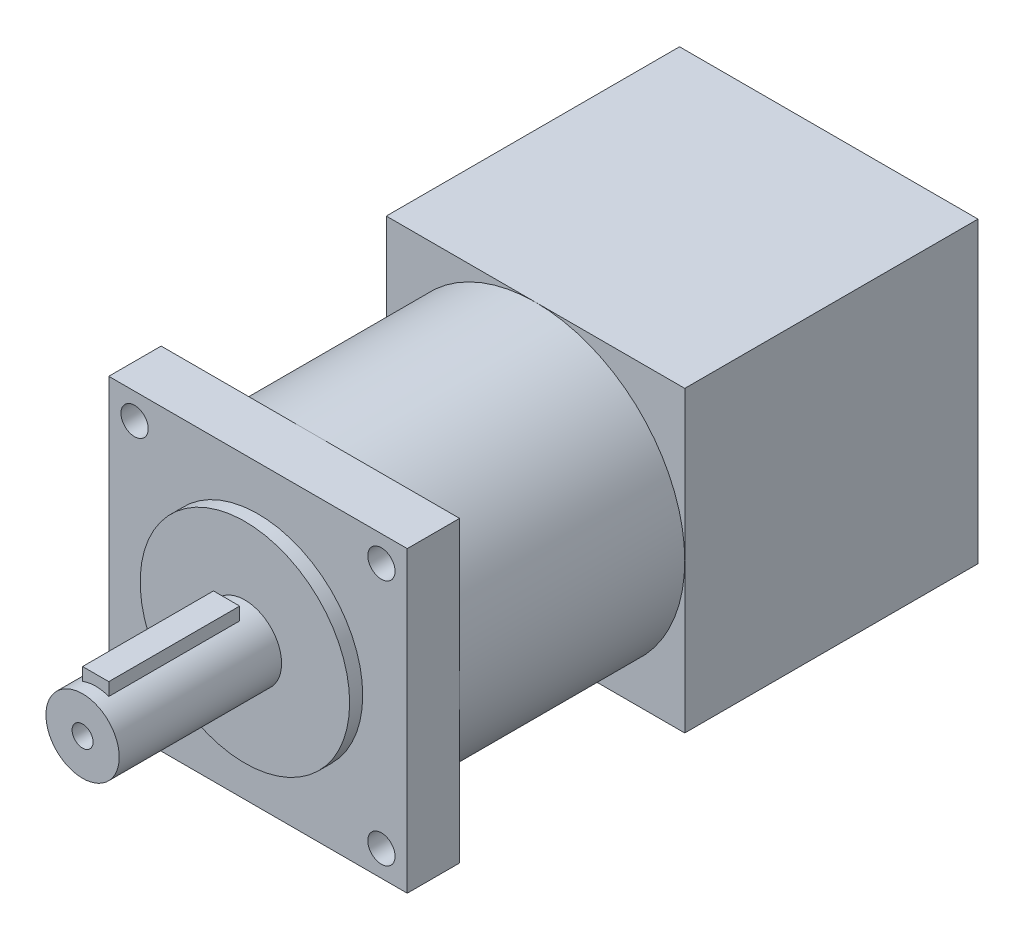
ISO-10303-21;
HEADER;
FILE_DESCRIPTION(('STEP AP214'),'2;1');
FILE_NAME('part.step','',(''),(''),'','','');
FILE_SCHEMA(('AUTOMOTIVE_DESIGN { 1 0 10303 214 1 1 1 1 }'));
ENDSEC;
DATA;
#1=APPLICATION_CONTEXT('core data for automotive mechanical design processes');
#2=APPLICATION_PROTOCOL_DEFINITION('international standard','automotive_design',2000,#1);
#3=PRODUCT_CONTEXT('',#1,'mechanical');
#4=PRODUCT('Part','Part','',(#3));
#5=PRODUCT_RELATED_PRODUCT_CATEGORY('part','',(#4));
#6=PRODUCT_DEFINITION_FORMATION('','',#4);
#7=PRODUCT_DEFINITION_CONTEXT('part definition',#1,'design');
#8=PRODUCT_DEFINITION('design','',#6,#7);
#9=PRODUCT_DEFINITION_SHAPE('','',#8);
#10=(LENGTH_UNIT() NAMED_UNIT(*) SI_UNIT(.MILLI.,.METRE.));
#11=(NAMED_UNIT(*) PLANE_ANGLE_UNIT() SI_UNIT($,.RADIAN.));
#12=(NAMED_UNIT(*) SI_UNIT($,.STERADIAN.) SOLID_ANGLE_UNIT());
#13=UNCERTAINTY_MEASURE_WITH_UNIT(LENGTH_MEASURE(1.E-05),#10,'distance_accuracy_value','');
#14=(GEOMETRIC_REPRESENTATION_CONTEXT(3) GLOBAL_UNCERTAINTY_ASSIGNED_CONTEXT((#13)) GLOBAL_UNIT_ASSIGNED_CONTEXT((#10,
#11,#12)) REPRESENTATION_CONTEXT('',''));
#15=CARTESIAN_POINT('',(0.,0.,0.));
#16=DIRECTION('',(0.,0.,1.));
#17=DIRECTION('',(1.,0.,0.));
#18=AXIS2_PLACEMENT_3D('',#15,#16,#17);
#19=CARTESIAN_POINT('',(0.,0.,142.5));
#20=DIRECTION('',(0.,0.,-1.));
#21=DIRECTION('',(-1.,0.,0.));
#22=AXIS2_PLACEMENT_3D('',#19,#20,#21);
#23=CYLINDRICAL_SURFACE('',#22,7.);
#24=CARTESIAN_POINT('',(0.,0.,111.5));
#25=DIRECTION('',(0.,0.,1.));
#26=DIRECTION('',(1.,0.,0.));
#27=AXIS2_PLACEMENT_3D('',#24,#25,#26);
#28=CIRCLE('',#27,7.);
#29=CARTESIAN_POINT('',(7.,0.,111.5));
#30=VERTEX_POINT('',#29);
#31=EDGE_CURVE('E246',#30,#30,#28,.T.);
#32=ORIENTED_EDGE('',*,*,#31,.T.);
#33=EDGE_LOOP('',(#32));
#34=FACE_BOUND('',#33,.T.);
#35=CARTESIAN_POINT('',(0.,0.,142.5));
#36=DIRECTION('',(0.,0.,1.));
#37=DIRECTION('',(1.,0.,0.));
#38=AXIS2_PLACEMENT_3D('',#35,#36,#37);
#39=CIRCLE('',#38,7.);
#40=CARTESIAN_POINT('',(7.,0.,142.5));
#41=VERTEX_POINT('',#40);
#42=EDGE_CURVE('E234',#41,#41,#39,.T.);
#43=ORIENTED_EDGE('',*,*,#42,.F.);
#44=EDGE_LOOP('',(#43));
#45=FACE_BOUND('',#44,.T.);
#46=CARTESIAN_POINT('',(0.,0.,115.));
#47=DIRECTION('',(0.,0.,1.));
#48=DIRECTION('',(1.,0.,0.));
#49=AXIS2_PLACEMENT_3D('',#46,#47,#48);
#50=CIRCLE('',#49,7.);
#51=CARTESIAN_POINT('',(2.5,6.53834841531101,115.));
#52=VERTEX_POINT('',#51);
#53=CARTESIAN_POINT('',(-2.5,6.53834841531101,115.));
#54=VERTEX_POINT('',#53);
#55=EDGE_CURVE('E11',#52,#54,#50,.T.);
#56=ORIENTED_EDGE('',*,*,#55,.F.);
#57=DIRECTION('',(0.,0.,-1.));
#58=VECTOR('',#57,1.);
#59=CARTESIAN_POINT('',(2.5,6.53834841531101,142.5));
#60=LINE('',#59,#58);
#61=CARTESIAN_POINT('',(2.5,6.53834841531101,140.));
#62=VERTEX_POINT('',#61);
#63=EDGE_CURVE('E156',#52,#62,#60,.F.);
#64=ORIENTED_EDGE('',*,*,#63,.T.);
#65=CARTESIAN_POINT('',(0.,0.,140.));
#66=DIRECTION('',(0.,0.,1.));
#67=DIRECTION('',(1.,0.,0.));
#68=AXIS2_PLACEMENT_3D('',#65,#66,#67);
#69=CIRCLE('',#68,7.);
#70=CARTESIAN_POINT('',(-2.5,6.53834841531101,140.));
#71=VERTEX_POINT('',#70);
#72=EDGE_CURVE('E300',#62,#71,#69,.T.);
#73=ORIENTED_EDGE('',*,*,#72,.T.);
#74=DIRECTION('',(0.,0.,-1.));
#75=VECTOR('',#74,1.);
#76=CARTESIAN_POINT('',(-2.5,6.53834841531101,142.5));
#77=LINE('',#76,#75);
#78=EDGE_CURVE('E43',#71,#54,#77,.T.);
#79=ORIENTED_EDGE('',*,*,#78,.T.);
#80=EDGE_LOOP('',(#56,#64,#73,#79));
#81=FACE_BOUND('',#80,.T.);
#82=ADVANCED_FACE('F35',(#34,#45,#81),#23,.T.);
#83=CARTESIAN_POINT('',(0.,0.,109.));
#84=DIRECTION('',(0.,0.,1.));
#85=DIRECTION('',(1.,0.,0.));
#86=AXIS2_PLACEMENT_3D('',#83,#84,#85);
#87=PLANE('',#86);
#88=CARTESIAN_POINT('',(0.,0.,109.));
#89=DIRECTION('',(0.,0.,1.));
#90=DIRECTION('',(1.,0.,0.));
#91=AXIS2_PLACEMENT_3D('',#88,#89,#90);
#92=CIRCLE('',#91,20.);
#93=CARTESIAN_POINT('',(20.,0.,109.));
#94=VERTEX_POINT('',#93);
#95=EDGE_CURVE('E250',#94,#94,#92,.T.);
#96=ORIENTED_EDGE('',*,*,#95,.F.);
#97=EDGE_LOOP('',(#96));
#98=FACE_BOUND('',#97,.T.);
#99=DIRECTION('',(1.,0.,0.));
#100=VECTOR('',#99,1.);
#101=CARTESIAN_POINT('',(-28.5,-28.5,109.));
#102=LINE('',#101,#100);
#103=CARTESIAN_POINT('',(-28.5,-28.5,109.));
#104=VERTEX_POINT('',#103);
#105=CARTESIAN_POINT('',(28.5,-28.5,109.));
#106=VERTEX_POINT('',#105);
#107=EDGE_CURVE('E228',#104,#106,#102,.T.);
#108=ORIENTED_EDGE('',*,*,#107,.T.);
#109=DIRECTION('',(0.,1.,0.));
#110=VECTOR('',#109,1.);
#111=CARTESIAN_POINT('',(28.5,-28.5,109.));
#112=LINE('',#111,#110);
#113=CARTESIAN_POINT('',(28.5,28.5,109.));
#114=VERTEX_POINT('',#113);
#115=EDGE_CURVE('E203',#106,#114,#112,.T.);
#116=ORIENTED_EDGE('',*,*,#115,.T.);
#117=DIRECTION('',(-1.,0.,0.));
#118=VECTOR('',#117,1.);
#119=CARTESIAN_POINT('',(-28.5,28.5,109.));
#120=LINE('',#119,#118);
#121=CARTESIAN_POINT('',(-28.5,28.5,109.));
#122=VERTEX_POINT('',#121);
#123=EDGE_CURVE('E223',#114,#122,#120,.T.);
#124=ORIENTED_EDGE('',*,*,#123,.T.);
#125=DIRECTION('',(0.,-1.,0.));
#126=VECTOR('',#125,1.);
#127=CARTESIAN_POINT('',(-28.5,-28.5,109.));
#128=LINE('',#127,#126);
#129=EDGE_CURVE('E225',#122,#104,#128,.T.);
#130=ORIENTED_EDGE('',*,*,#129,.T.);
#131=EDGE_LOOP('',(#108,#116,#124,#130));
#132=FACE_BOUND('',#131,.T.);
#133=CARTESIAN_POINT('',(-23.5699999999987,-23.57,109.));
#134=DIRECTION('',(0.,0.,1.));
#135=DIRECTION('',(1.,0.,0.));
#136=AXIS2_PLACEMENT_3D('',#133,#134,#135);
#137=CIRCLE('',#136,2.60000000000069);
#138=CARTESIAN_POINT('',(-20.969999999998,-23.57,109.));
#139=VERTEX_POINT('',#138);
#140=EDGE_CURVE('E180',#139,#139,#137,.T.);
#141=ORIENTED_EDGE('',*,*,#140,.F.);
#142=EDGE_LOOP('',(#141));
#143=FACE_BOUND('',#142,.T.);
#144=CARTESIAN_POINT('',(23.5700000000013,-23.5699999999987,109.));
#145=DIRECTION('',(0.,0.,1.));
#146=DIRECTION('',(1.,0.,0.));
#147=AXIS2_PLACEMENT_3D('',#144,#145,#146);
#148=CIRCLE('',#147,2.60000000000186);
#149=CARTESIAN_POINT('',(26.1700000000032,-23.5699999999987,109.));
#150=VERTEX_POINT('',#149);
#151=EDGE_CURVE('E185',#150,#150,#148,.T.);
#152=ORIENTED_EDGE('',*,*,#151,.F.);
#153=EDGE_LOOP('',(#152));
#154=FACE_BOUND('',#153,.T.);
#155=CARTESIAN_POINT('',(23.57,23.5700000000013,109.));
#156=DIRECTION('',(0.,0.,1.));
#157=DIRECTION('',(1.,0.,0.));
#158=AXIS2_PLACEMENT_3D('',#155,#156,#157);
#159=CIRCLE('',#158,2.60000000000137);
#160=CARTESIAN_POINT('',(26.1700000000014,23.5700000000013,109.));
#161=VERTEX_POINT('',#160);
#162=EDGE_CURVE('E191',#161,#161,#159,.T.);
#163=ORIENTED_EDGE('',*,*,#162,.F.);
#164=EDGE_LOOP('',(#163));
#165=FACE_BOUND('',#164,.T.);
#166=CARTESIAN_POINT('',(-23.57,23.57,109.));
#167=DIRECTION('',(0.,0.,1.));
#168=DIRECTION('',(1.,0.,0.));
#169=AXIS2_PLACEMENT_3D('',#166,#167,#168);
#170=CIRCLE('',#169,2.6);
#171=CARTESIAN_POINT('',(-20.97,23.57,109.));
#172=VERTEX_POINT('',#171);
#173=EDGE_CURVE('E197',#172,#172,#170,.T.);
#174=ORIENTED_EDGE('',*,*,#173,.F.);
#175=EDGE_LOOP('',(#174));
#176=FACE_BOUND('',#175,.T.);
#177=ADVANCED_FACE('F332',(#98,#132,#143,#154,#165,#176),#87,.T.);
#178=CARTESIAN_POINT('',(0.,0.,111.5));
#179=DIRECTION('',(0.,0.,-1.));
#180=DIRECTION('',(-1.,0.,0.));
#181=AXIS2_PLACEMENT_3D('',#178,#179,#180);
#182=CYLINDRICAL_SURFACE('',#181,20.);
#183=CARTESIAN_POINT('',(0.,0.,111.5));
#184=DIRECTION('',(0.,0.,1.));
#185=DIRECTION('',(1.,0.,0.));
#186=AXIS2_PLACEMENT_3D('',#183,#184,#185);
#187=CIRCLE('',#186,20.);
#188=CARTESIAN_POINT('',(20.,0.,111.5));
#189=VERTEX_POINT('',#188);
#190=EDGE_CURVE('E245',#189,#189,#187,.T.);
#191=ORIENTED_EDGE('',*,*,#190,.F.);
#192=EDGE_LOOP('',(#191));
#193=FACE_BOUND('',#192,.T.);
#194=ORIENTED_EDGE('',*,*,#95,.T.);
#195=EDGE_LOOP('',(#194));
#196=FACE_BOUND('',#195,.T.);
#197=ADVANCED_FACE('F338',(#193,#196),#182,.T.);
#198=CARTESIAN_POINT('',(0.,0.,111.5));
#199=DIRECTION('',(0.,0.,1.));
#200=DIRECTION('',(1.,0.,0.));
#201=AXIS2_PLACEMENT_3D('',#198,#199,#200);
#202=PLANE('',#201);
#203=ORIENTED_EDGE('',*,*,#31,.F.);
#204=EDGE_LOOP('',(#203));
#205=FACE_BOUND('',#204,.T.);
#206=ORIENTED_EDGE('',*,*,#190,.T.);
#207=EDGE_LOOP('',(#206));
#208=FACE_BOUND('',#207,.T.);
#209=ADVANCED_FACE('F327',(#205,#208),#202,.T.);
#210=CARTESIAN_POINT('',(0.,0.,142.5));
#211=DIRECTION('',(0.,0.,1.));
#212=DIRECTION('',(1.,0.,0.));
#213=AXIS2_PLACEMENT_3D('',#210,#211,#212);
#214=PLANE('',#213);
#215=CARTESIAN_POINT('',(0.,0.,142.5));
#216=DIRECTION('',(0.,0.,1.));
#217=DIRECTION('',(1.,0.,0.));
#218=AXIS2_PLACEMENT_3D('',#215,#216,#217);
#219=CIRCLE('',#218,2.);
#220=CARTESIAN_POINT('',(2.,0.,142.5));
#221=VERTEX_POINT('',#220);
#222=EDGE_CURVE('E308',#221,#221,#219,.T.);
#223=ORIENTED_EDGE('',*,*,#222,.F.);
#224=EDGE_LOOP('',(#223));
#225=FACE_BOUND('',#224,.T.);
#226=ORIENTED_EDGE('',*,*,#42,.T.);
#227=EDGE_LOOP('',(#226));
#228=FACE_BOUND('',#227,.T.);
#229=ADVANCED_FACE('F323',(#225,#228),#214,.T.);
#230=CARTESIAN_POINT('',(0.,0.,99.));
#231=DIRECTION('',(0.,0.,-1.));
#232=DIRECTION('',(-1.,0.,0.));
#233=AXIS2_PLACEMENT_3D('',#230,#231,#232);
#234=PLANE('',#233);
#235=CARTESIAN_POINT('',(0.,0.,99.));
#236=DIRECTION('',(0.,0.,-1.));
#237=DIRECTION('',(-1.,0.,0.));
#238=AXIS2_PLACEMENT_3D('',#235,#236,#237);
#239=CIRCLE('',#238,28.5);
#240=CARTESIAN_POINT('',(-28.5,0.,99.));
#241=VERTEX_POINT('',#240);
#242=CARTESIAN_POINT('',(0.,28.5,99.));
#243=VERTEX_POINT('',#242);
#244=EDGE_CURVE('E299',#241,#243,#239,.T.);
#245=ORIENTED_EDGE('',*,*,#244,.F.);
#246=DIRECTION('',(0.,-1.,0.));
#247=VECTOR('',#246,1.);
#248=CARTESIAN_POINT('',(-28.5,-28.5,99.));
#249=LINE('',#248,#247);
#250=CARTESIAN_POINT('',(-28.5,28.5,99.));
#251=VERTEX_POINT('',#250);
#252=EDGE_CURVE('E58',#251,#241,#249,.T.);
#253=ORIENTED_EDGE('',*,*,#252,.F.);
#254=DIRECTION('',(-1.,0.,0.));
#255=VECTOR('',#254,1.);
#256=CARTESIAN_POINT('',(-28.5,28.5,99.));
#257=LINE('',#256,#255);
#258=EDGE_CURVE('E209',#243,#251,#257,.T.);
#259=ORIENTED_EDGE('',*,*,#258,.F.);
#260=EDGE_LOOP('',(#245,#253,#259));
#261=FACE_BOUND('',#260,.T.);
#262=CARTESIAN_POINT('',(-23.57,23.57,99.));
#263=DIRECTION('',(0.,0.,1.));
#264=DIRECTION('',(1.,0.,0.));
#265=AXIS2_PLACEMENT_3D('',#262,#263,#264);
#266=CIRCLE('',#265,2.6);
#267=CARTESIAN_POINT('',(-20.97,23.57,99.));
#268=VERTEX_POINT('',#267);
#269=EDGE_CURVE('E200',#268,#268,#266,.T.);
#270=ORIENTED_EDGE('',*,*,#269,.T.);
#271=EDGE_LOOP('',(#270));
#272=FACE_BOUND('',#271,.T.);
#273=ADVANCED_FACE('F326',(#261,#272),#234,.T.);
#274=CARTESIAN_POINT('',(28.5,0.,99.));
#275=VERTEX_POINT('',#274);
#276=EDGE_CURVE('E671',#243,#275,#239,.T.);
#277=ORIENTED_EDGE('',*,*,#276,.F.);
#278=CARTESIAN_POINT('',(28.5,28.5,99.));
#279=VERTEX_POINT('',#278);
#280=EDGE_CURVE('E211',#279,#243,#257,.T.);
#281=ORIENTED_EDGE('',*,*,#280,.F.);
#282=DIRECTION('',(0.,1.,0.));
#283=VECTOR('',#282,1.);
#284=CARTESIAN_POINT('',(28.5,-28.5,99.));
#285=LINE('',#284,#283);
#286=EDGE_CURVE('E210',#275,#279,#285,.T.);
#287=ORIENTED_EDGE('',*,*,#286,.F.);
#288=EDGE_LOOP('',(#277,#281,#287));
#289=FACE_BOUND('',#288,.T.);
#290=CARTESIAN_POINT('',(23.57,23.5700000000013,99.));
#291=DIRECTION('',(0.,0.,1.));
#292=DIRECTION('',(1.,0.,0.));
#293=AXIS2_PLACEMENT_3D('',#290,#291,#292);
#294=CIRCLE('',#293,2.60000000000137);
#295=CARTESIAN_POINT('',(26.1700000000014,23.5700000000013,99.));
#296=VERTEX_POINT('',#295);
#297=EDGE_CURVE('E194',#296,#296,#294,.T.);
#298=ORIENTED_EDGE('',*,*,#297,.T.);
#299=EDGE_LOOP('',(#298));
#300=FACE_BOUND('',#299,.T.);
#301=ADVANCED_FACE('F520',(#289,#300),#234,.T.);
#302=CARTESIAN_POINT('',(0.,-28.5,99.));
#303=VERTEX_POINT('',#302);
#304=EDGE_CURVE('E298',#275,#303,#239,.T.);
#305=ORIENTED_EDGE('',*,*,#304,.F.);
#306=CARTESIAN_POINT('',(28.5,-28.5,99.));
#307=VERTEX_POINT('',#306);
#308=EDGE_CURVE('E206',#307,#275,#285,.T.);
#309=ORIENTED_EDGE('',*,*,#308,.F.);
#310=DIRECTION('',(1.,0.,0.));
#311=VECTOR('',#310,1.);
#312=CARTESIAN_POINT('',(-28.5,-28.5,99.));
#313=LINE('',#312,#311);
#314=EDGE_CURVE('E216',#303,#307,#313,.T.);
#315=ORIENTED_EDGE('',*,*,#314,.F.);
#316=EDGE_LOOP('',(#305,#309,#315));
#317=FACE_BOUND('',#316,.T.);
#318=CARTESIAN_POINT('',(23.5700000000013,-23.5699999999987,99.));
#319=DIRECTION('',(0.,0.,1.));
#320=DIRECTION('',(1.,0.,0.));
#321=AXIS2_PLACEMENT_3D('',#318,#319,#320);
#322=CIRCLE('',#321,2.60000000000186);
#323=CARTESIAN_POINT('',(26.1700000000032,-23.5699999999987,99.));
#324=VERTEX_POINT('',#323);
#325=EDGE_CURVE('E188',#324,#324,#322,.T.);
#326=ORIENTED_EDGE('',*,*,#325,.T.);
#327=EDGE_LOOP('',(#326));
#328=FACE_BOUND('',#327,.T.);
#329=ADVANCED_FACE('F485',(#317,#328),#234,.T.);
#330=CARTESIAN_POINT('',(28.5,-28.5,99.));
#331=DIRECTION('',(1.,0.,0.));
#332=DIRECTION('',(0.,0.,-1.));
#333=AXIS2_PLACEMENT_3D('',#330,#331,#332);
#334=PLANE('',#333);
#335=ORIENTED_EDGE('',*,*,#308,.T.);
#336=ORIENTED_EDGE('',*,*,#286,.T.);
#337=DIRECTION('',(0.,0.,1.));
#338=VECTOR('',#337,1.);
#339=CARTESIAN_POINT('',(28.5,28.5,99.));
#340=LINE('',#339,#338);
#341=EDGE_CURVE('E220',#279,#114,#340,.T.);
#342=ORIENTED_EDGE('',*,*,#341,.T.);
#343=ORIENTED_EDGE('',*,*,#115,.F.);
#344=DIRECTION('',(0.,0.,1.));
#345=VECTOR('',#344,1.);
#346=CARTESIAN_POINT('',(28.5,-28.5,99.));
#347=LINE('',#346,#345);
#348=EDGE_CURVE('E231',#307,#106,#347,.T.);
#349=ORIENTED_EDGE('',*,*,#348,.F.);
#350=EDGE_LOOP('',(#335,#336,#342,#343,#349));
#351=FACE_BOUND('',#350,.T.);
#352=ADVANCED_FACE('F506',(#351),#334,.T.);
#353=CARTESIAN_POINT('',(-28.5,-28.5,99.));
#354=DIRECTION('',(0.,-1.,0.));
#355=DIRECTION('',(0.,0.,-1.));
#356=AXIS2_PLACEMENT_3D('',#353,#354,#355);
#357=PLANE('',#356);
#358=CARTESIAN_POINT('',(-28.5,-28.5,99.));
#359=VERTEX_POINT('',#358);
#360=EDGE_CURVE('E217',#359,#303,#313,.T.);
#361=ORIENTED_EDGE('',*,*,#360,.T.);
#362=ORIENTED_EDGE('',*,*,#314,.T.);
#363=ORIENTED_EDGE('',*,*,#348,.T.);
#364=ORIENTED_EDGE('',*,*,#107,.F.);
#365=DIRECTION('',(0.,0.,1.));
#366=VECTOR('',#365,1.);
#367=CARTESIAN_POINT('',(-28.5,-28.5,99.));
#368=LINE('',#367,#366);
#369=EDGE_CURVE('E235',#359,#104,#368,.T.);
#370=ORIENTED_EDGE('',*,*,#369,.F.);
#371=EDGE_LOOP('',(#361,#362,#363,#364,#370));
#372=FACE_BOUND('',#371,.T.);
#373=ADVANCED_FACE('F499',(#372),#357,.T.);
#374=CARTESIAN_POINT('',(-28.5,-28.5,99.));
#375=DIRECTION('',(-1.,0.,0.));
#376=DIRECTION('',(0.,0.,1.));
#377=AXIS2_PLACEMENT_3D('',#374,#375,#376);
#378=PLANE('',#377);
#379=ORIENTED_EDGE('',*,*,#252,.T.);
#380=EDGE_CURVE('E214',#241,#359,#249,.T.);
#381=ORIENTED_EDGE('',*,*,#380,.T.);
#382=ORIENTED_EDGE('',*,*,#369,.T.);
#383=ORIENTED_EDGE('',*,*,#129,.F.);
#384=DIRECTION('',(0.,0.,1.));
#385=VECTOR('',#384,1.);
#386=CARTESIAN_POINT('',(-28.5,28.5,99.));
#387=LINE('',#386,#385);
#388=EDGE_CURVE('E238',#251,#122,#387,.T.);
#389=ORIENTED_EDGE('',*,*,#388,.F.);
#390=EDGE_LOOP('',(#379,#381,#382,#383,#389));
#391=FACE_BOUND('',#390,.T.);
#392=ADVANCED_FACE('F491',(#391),#378,.T.);
#393=CARTESIAN_POINT('',(-28.5,28.5,99.));
#394=DIRECTION('',(0.,1.,0.));
#395=DIRECTION('',(0.,0.,1.));
#396=AXIS2_PLACEMENT_3D('',#393,#394,#395);
#397=PLANE('',#396);
#398=ORIENTED_EDGE('',*,*,#280,.T.);
#399=ORIENTED_EDGE('',*,*,#258,.T.);
#400=ORIENTED_EDGE('',*,*,#388,.T.);
#401=ORIENTED_EDGE('',*,*,#123,.F.);
#402=ORIENTED_EDGE('',*,*,#341,.F.);
#403=EDGE_LOOP('',(#398,#399,#400,#401,#402));
#404=FACE_BOUND('',#403,.T.);
#405=ADVANCED_FACE('F482',(#404),#397,.T.);
#406=EDGE_CURVE('E249',#303,#241,#239,.T.);
#407=ORIENTED_EDGE('',*,*,#406,.F.);
#408=ORIENTED_EDGE('',*,*,#360,.F.);
#409=ORIENTED_EDGE('',*,*,#380,.F.);
#410=EDGE_LOOP('',(#407,#408,#409));
#411=FACE_BOUND('',#410,.T.);
#412=CARTESIAN_POINT('',(-23.5699999999987,-23.57,99.));
#413=DIRECTION('',(0.,0.,1.));
#414=DIRECTION('',(1.,0.,0.));
#415=AXIS2_PLACEMENT_3D('',#412,#413,#414);
#416=CIRCLE('',#415,2.60000000000069);
#417=CARTESIAN_POINT('',(-20.969999999998,-23.57,99.));
#418=VERTEX_POINT('',#417);
#419=EDGE_CURVE('E182',#418,#418,#416,.T.);
#420=ORIENTED_EDGE('',*,*,#419,.T.);
#421=EDGE_LOOP('',(#420));
#422=FACE_BOUND('',#421,.T.);
#423=ADVANCED_FACE('F474',(#411,#422),#234,.T.);
#424=CARTESIAN_POINT('',(-23.57,23.57,99.));
#425=DIRECTION('',(0.,0.,1.));
#426=DIRECTION('',(1.,0.,0.));
#427=AXIS2_PLACEMENT_3D('',#424,#425,#426);
#428=CYLINDRICAL_SURFACE('',#427,2.6);
#429=ORIENTED_EDGE('',*,*,#269,.F.);
#430=EDGE_LOOP('',(#429));
#431=FACE_BOUND('',#430,.T.);
#432=ORIENTED_EDGE('',*,*,#173,.T.);
#433=EDGE_LOOP('',(#432));
#434=FACE_BOUND('',#433,.T.);
#435=ADVANCED_FACE('F466',(#431,#434),#428,.F.);
#436=CARTESIAN_POINT('',(23.57,23.5700000000013,99.));
#437=DIRECTION('',(0.,0.,1.));
#438=DIRECTION('',(1.,0.,0.));
#439=AXIS2_PLACEMENT_3D('',#436,#437,#438);
#440=CYLINDRICAL_SURFACE('',#439,2.60000000000137);
#441=ORIENTED_EDGE('',*,*,#297,.F.);
#442=EDGE_LOOP('',(#441));
#443=FACE_BOUND('',#442,.T.);
#444=ORIENTED_EDGE('',*,*,#162,.T.);
#445=EDGE_LOOP('',(#444));
#446=FACE_BOUND('',#445,.T.);
#447=ADVANCED_FACE('F458',(#443,#446),#440,.F.);
#448=CARTESIAN_POINT('',(23.5700000000013,-23.5699999999987,99.));
#449=DIRECTION('',(0.,0.,1.));
#450=DIRECTION('',(1.,0.,0.));
#451=AXIS2_PLACEMENT_3D('',#448,#449,#450);
#452=CYLINDRICAL_SURFACE('',#451,2.60000000000186);
#453=ORIENTED_EDGE('',*,*,#325,.F.);
#454=EDGE_LOOP('',(#453));
#455=FACE_BOUND('',#454,.T.);
#456=ORIENTED_EDGE('',*,*,#151,.T.);
#457=EDGE_LOOP('',(#456));
#458=FACE_BOUND('',#457,.T.);
#459=ADVANCED_FACE('F449',(#455,#458),#452,.F.);
#460=CARTESIAN_POINT('',(-23.5699999999987,-23.57,99.));
#461=DIRECTION('',(0.,0.,1.));
#462=DIRECTION('',(1.,0.,0.));
#463=AXIS2_PLACEMENT_3D('',#460,#461,#462);
#464=CYLINDRICAL_SURFACE('',#463,2.60000000000069);
#465=ORIENTED_EDGE('',*,*,#419,.F.);
#466=EDGE_LOOP('',(#465));
#467=FACE_BOUND('',#466,.T.);
#468=ORIENTED_EDGE('',*,*,#140,.T.);
#469=EDGE_LOOP('',(#468));
#470=FACE_BOUND('',#469,.T.);
#471=ADVANCED_FACE('F363',(#467,#470),#464,.F.);
#472=CARTESIAN_POINT('',(0.,0.,0.));
#473=DIRECTION('',(0.,0.,1.));
#474=DIRECTION('',(1.,0.,0.));
#475=AXIS2_PLACEMENT_3D('',#472,#473,#474);
#476=PLANE('',#475);
#477=DIRECTION('',(0.,1.,0.));
#478=VECTOR('',#477,1.);
#479=CARTESIAN_POINT('',(28.5,28.5,0.));
#480=LINE('',#479,#478);
#481=CARTESIAN_POINT('',(28.5,-28.5,0.));
#482=VERTEX_POINT('',#481);
#483=CARTESIAN_POINT('',(28.5,28.5,0.));
#484=VERTEX_POINT('',#483);
#485=EDGE_CURVE('E259',#482,#484,#480,.T.);
#486=ORIENTED_EDGE('',*,*,#485,.F.);
#487=DIRECTION('',(1.,0.,0.));
#488=VECTOR('',#487,1.);
#489=CARTESIAN_POINT('',(-28.5,-28.5,0.));
#490=LINE('',#489,#488);
#491=CARTESIAN_POINT('',(-28.5,-28.5,0.));
#492=VERTEX_POINT('',#491);
#493=EDGE_CURVE('E283',#492,#482,#490,.T.);
#494=ORIENTED_EDGE('',*,*,#493,.F.);
#495=DIRECTION('',(0.,-1.,0.));
#496=VECTOR('',#495,1.);
#497=CARTESIAN_POINT('',(-28.5,28.5,0.));
#498=LINE('',#497,#496);
#499=CARTESIAN_POINT('',(-28.5,28.5,0.));
#500=VERTEX_POINT('',#499);
#501=EDGE_CURVE('E281',#500,#492,#498,.T.);
#502=ORIENTED_EDGE('',*,*,#501,.F.);
#503=DIRECTION('',(-1.,0.,0.));
#504=VECTOR('',#503,1.);
#505=CARTESIAN_POINT('',(-28.5,28.5,0.));
#506=LINE('',#505,#504);
#507=EDGE_CURVE('E279',#484,#500,#506,.T.);
#508=ORIENTED_EDGE('',*,*,#507,.F.);
#509=EDGE_LOOP('',(#486,#494,#502,#508));
#510=FACE_BOUND('',#509,.T.);
#511=ADVANCED_FACE('F359',(#510),#476,.F.);
#512=CARTESIAN_POINT('',(-28.5,-28.5,56.));
#513=DIRECTION('',(0.,1.,0.));
#514=DIRECTION('',(0.,0.,1.));
#515=AXIS2_PLACEMENT_3D('',#512,#513,#514);
#516=PLANE('',#515);
#517=ORIENTED_EDGE('',*,*,#493,.T.);
#518=DIRECTION('',(0.,0.,-1.));
#519=VECTOR('',#518,1.);
#520=CARTESIAN_POINT('',(28.5,-28.5,56.));
#521=LINE('',#520,#519);
#522=CARTESIAN_POINT('',(28.5,-28.5,56.));
#523=VERTEX_POINT('',#522);
#524=EDGE_CURVE('E276',#523,#482,#521,.T.);
#525=ORIENTED_EDGE('',*,*,#524,.F.);
#526=DIRECTION('',(1.,0.,0.));
#527=VECTOR('',#526,1.);
#528=CARTESIAN_POINT('',(-28.5,-28.5,56.));
#529=LINE('',#528,#527);
#530=CARTESIAN_POINT('',(0.,-28.5,56.));
#531=VERTEX_POINT('',#530);
#532=EDGE_CURVE('E272',#531,#523,#529,.T.);
#533=ORIENTED_EDGE('',*,*,#532,.F.);
#534=CARTESIAN_POINT('',(-28.5,-28.5,56.));
#535=VERTEX_POINT('',#534);
#536=EDGE_CURVE('E273',#535,#531,#529,.T.);
#537=ORIENTED_EDGE('',*,*,#536,.F.);
#538=DIRECTION('',(0.,0.,-1.));
#539=VECTOR('',#538,1.);
#540=CARTESIAN_POINT('',(-28.5,-28.5,56.));
#541=LINE('',#540,#539);
#542=EDGE_CURVE('E287',#535,#492,#541,.T.);
#543=ORIENTED_EDGE('',*,*,#542,.T.);
#544=EDGE_LOOP('',(#517,#525,#533,#537,#543));
#545=FACE_BOUND('',#544,.T.);
#546=ADVANCED_FACE('F362',(#545),#516,.F.);
#547=CARTESIAN_POINT('',(-28.5,28.5,56.));
#548=DIRECTION('',(1.,0.,0.));
#549=DIRECTION('',(0.,1.,0.));
#550=AXIS2_PLACEMENT_3D('',#547,#548,#549);
#551=PLANE('',#550);
#552=ORIENTED_EDGE('',*,*,#501,.T.);
#553=ORIENTED_EDGE('',*,*,#542,.F.);
#554=DIRECTION('',(0.,-1.,0.));
#555=VECTOR('',#554,1.);
#556=CARTESIAN_POINT('',(-28.5,28.5,56.));
#557=LINE('',#556,#555);
#558=CARTESIAN_POINT('',(-28.5,0.,56.));
#559=VERTEX_POINT('',#558);
#560=EDGE_CURVE('E268',#559,#535,#557,.T.);
#561=ORIENTED_EDGE('',*,*,#560,.F.);
#562=CARTESIAN_POINT('',(-28.5,28.5,56.));
#563=VERTEX_POINT('',#562);
#564=EDGE_CURVE('E269',#563,#559,#557,.T.);
#565=ORIENTED_EDGE('',*,*,#564,.F.);
#566=DIRECTION('',(0.,0.,-1.));
#567=VECTOR('',#566,1.);
#568=CARTESIAN_POINT('',(-28.5,28.5,56.));
#569=LINE('',#568,#567);
#570=EDGE_CURVE('E290',#563,#500,#569,.T.);
#571=ORIENTED_EDGE('',*,*,#570,.T.);
#572=EDGE_LOOP('',(#552,#553,#561,#565,#571));
#573=FACE_BOUND('',#572,.T.);
#574=ADVANCED_FACE('F367',(#573),#551,.F.);
#575=CARTESIAN_POINT('',(-28.5,28.5,56.));
#576=DIRECTION('',(0.,-1.,0.));
#577=DIRECTION('',(0.,0.,-1.));
#578=AXIS2_PLACEMENT_3D('',#575,#576,#577);
#579=PLANE('',#578);
#580=ORIENTED_EDGE('',*,*,#507,.T.);
#581=ORIENTED_EDGE('',*,*,#570,.F.);
#582=DIRECTION('',(-1.,0.,0.));
#583=VECTOR('',#582,1.);
#584=CARTESIAN_POINT('',(-28.5,28.5,56.));
#585=LINE('',#584,#583);
#586=CARTESIAN_POINT('',(0.,28.5,56.));
#587=VERTEX_POINT('',#586);
#588=EDGE_CURVE('E263',#587,#563,#585,.T.);
#589=ORIENTED_EDGE('',*,*,#588,.F.);
#590=CARTESIAN_POINT('',(28.5,28.5,56.));
#591=VERTEX_POINT('',#590);
#592=EDGE_CURVE('E265',#591,#587,#585,.T.);
#593=ORIENTED_EDGE('',*,*,#592,.F.);
#594=DIRECTION('',(0.,0.,-1.));
#595=VECTOR('',#594,1.);
#596=CARTESIAN_POINT('',(28.5,28.5,56.));
#597=LINE('',#596,#595);
#598=EDGE_CURVE('E293',#591,#484,#597,.T.);
#599=ORIENTED_EDGE('',*,*,#598,.T.);
#600=EDGE_LOOP('',(#580,#581,#589,#593,#599));
#601=FACE_BOUND('',#600,.T.);
#602=ADVANCED_FACE('F370',(#601),#579,.F.);
#603=CARTESIAN_POINT('',(28.5,28.5,56.));
#604=DIRECTION('',(-1.,0.,0.));
#605=DIRECTION('',(0.,-1.,0.));
#606=AXIS2_PLACEMENT_3D('',#603,#604,#605);
#607=PLANE('',#606);
#608=ORIENTED_EDGE('',*,*,#485,.T.);
#609=ORIENTED_EDGE('',*,*,#598,.F.);
#610=DIRECTION('',(0.,1.,0.));
#611=VECTOR('',#610,1.);
#612=CARTESIAN_POINT('',(28.5,28.5,56.));
#613=LINE('',#612,#611);
#614=CARTESIAN_POINT('',(28.5,0.,56.));
#615=VERTEX_POINT('',#614);
#616=EDGE_CURVE('E264',#615,#591,#613,.T.);
#617=ORIENTED_EDGE('',*,*,#616,.F.);
#618=EDGE_CURVE('E261',#523,#615,#613,.T.);
#619=ORIENTED_EDGE('',*,*,#618,.F.);
#620=ORIENTED_EDGE('',*,*,#524,.T.);
#621=EDGE_LOOP('',(#608,#609,#617,#619,#620));
#622=FACE_BOUND('',#621,.T.);
#623=ADVANCED_FACE('F37',(#622),#607,.F.);
#624=CARTESIAN_POINT('',(0.,0.,56.));
#625=DIRECTION('',(0.,0.,1.));
#626=DIRECTION('',(1.,0.,0.));
#627=AXIS2_PLACEMENT_3D('',#624,#625,#626);
#628=PLANE('',#627);
#629=CARTESIAN_POINT('',(0.,0.,56.));
#630=DIRECTION('',(0.,0.,1.));
#631=DIRECTION('',(1.,0.,0.));
#632=AXIS2_PLACEMENT_3D('',#629,#630,#631);
#633=CIRCLE('',#632,28.5);
#634=EDGE_CURVE('E260',#531,#615,#633,.T.);
#635=ORIENTED_EDGE('',*,*,#634,.F.);
#636=ORIENTED_EDGE('',*,*,#532,.T.);
#637=ORIENTED_EDGE('',*,*,#618,.T.);
#638=EDGE_LOOP('',(#635,#636,#637));
#639=FACE_BOUND('',#638,.T.);
#640=ADVANCED_FACE('F354',(#639),#628,.T.);
#641=EDGE_CURVE('E397',#559,#531,#633,.T.);
#642=ORIENTED_EDGE('',*,*,#641,.F.);
#643=ORIENTED_EDGE('',*,*,#560,.T.);
#644=ORIENTED_EDGE('',*,*,#536,.T.);
#645=EDGE_LOOP('',(#642,#643,#644));
#646=FACE_BOUND('',#645,.T.);
#647=ADVANCED_FACE('F357',(#646),#628,.T.);
#648=EDGE_CURVE('E256',#587,#559,#633,.T.);
#649=ORIENTED_EDGE('',*,*,#648,.F.);
#650=ORIENTED_EDGE('',*,*,#588,.T.);
#651=ORIENTED_EDGE('',*,*,#564,.T.);
#652=EDGE_LOOP('',(#649,#650,#651));
#653=FACE_BOUND('',#652,.T.);
#654=ADVANCED_FACE('F401',(#653),#628,.T.);
#655=EDGE_CURVE('E253',#615,#587,#633,.T.);
#656=ORIENTED_EDGE('',*,*,#655,.F.);
#657=ORIENTED_EDGE('',*,*,#616,.T.);
#658=ORIENTED_EDGE('',*,*,#592,.T.);
#659=EDGE_LOOP('',(#656,#657,#658));
#660=FACE_BOUND('',#659,.T.);
#661=ADVANCED_FACE('F352',(#660),#628,.T.);
#662=CARTESIAN_POINT('',(0.,0.,109.));
#663=DIRECTION('',(0.,0.,-1.));
#664=DIRECTION('',(-1.,0.,0.));
#665=AXIS2_PLACEMENT_3D('',#662,#663,#664);
#666=CYLINDRICAL_SURFACE('',#665,28.5);
#667=ORIENTED_EDGE('',*,*,#406,.T.);
#668=ORIENTED_EDGE('',*,*,#244,.T.);
#669=ORIENTED_EDGE('',*,*,#276,.T.);
#670=ORIENTED_EDGE('',*,*,#304,.T.);
#671=EDGE_LOOP('',(#667,#668,#669,#670));
#672=FACE_BOUND('',#671,.T.);
#673=ORIENTED_EDGE('',*,*,#655,.T.);
#674=ORIENTED_EDGE('',*,*,#648,.T.);
#675=ORIENTED_EDGE('',*,*,#641,.T.);
#676=ORIENTED_EDGE('',*,*,#634,.T.);
#677=EDGE_LOOP('',(#673,#674,#675,#676));
#678=FACE_BOUND('',#677,.T.);
#679=ADVANCED_FACE('F349',(#672,#678),#666,.T.);
#680=CARTESIAN_POINT('',(-2.5,5.,115.));
#681=DIRECTION('',(-1.,0.,0.));
#682=DIRECTION('',(0.,0.,1.));
#683=AXIS2_PLACEMENT_3D('',#680,#681,#682);
#684=PLANE('',#683);
#685=ORIENTED_EDGE('',*,*,#78,.F.);
#686=DIRECTION('',(0.,-1.,0.));
#687=VECTOR('',#686,1.);
#688=CARTESIAN_POINT('',(-2.5,5.,140.));
#689=LINE('',#688,#687);
#690=CARTESIAN_POINT('',(-2.5,9.,140.));
#691=VERTEX_POINT('',#690);
#692=EDGE_CURVE('E50',#691,#71,#689,.T.);
#693=ORIENTED_EDGE('',*,*,#692,.F.);
#694=DIRECTION('',(0.,0.,1.));
#695=VECTOR('',#694,1.);
#696=CARTESIAN_POINT('',(-2.5,9.,115.));
#697=LINE('',#696,#695);
#698=CARTESIAN_POINT('',(-2.5,9.,115.));
#699=VERTEX_POINT('',#698);
#700=EDGE_CURVE('E167',#699,#691,#697,.T.);
#701=ORIENTED_EDGE('',*,*,#700,.F.);
#702=DIRECTION('',(0.,-1.,0.));
#703=VECTOR('',#702,1.);
#704=CARTESIAN_POINT('',(-2.5,5.,115.));
#705=LINE('',#704,#703);
#706=EDGE_CURVE('E161',#699,#54,#705,.T.);
#707=ORIENTED_EDGE('',*,*,#706,.T.);
#708=EDGE_LOOP('',(#685,#693,#701,#707));
#709=FACE_BOUND('',#708,.T.);
#710=ADVANCED_FACE('F306',(#709),#684,.T.);
#711=CARTESIAN_POINT('',(2.5,5.,115.));
#712=DIRECTION('',(1.,0.,0.));
#713=DIRECTION('',(0.,0.,-1.));
#714=AXIS2_PLACEMENT_3D('',#711,#712,#713);
#715=PLANE('',#714);
#716=ORIENTED_EDGE('',*,*,#63,.F.);
#717=DIRECTION('',(0.,1.,0.));
#718=VECTOR('',#717,1.);
#719=CARTESIAN_POINT('',(2.5,5.,115.));
#720=LINE('',#719,#718);
#721=CARTESIAN_POINT('',(2.5,9.,115.));
#722=VERTEX_POINT('',#721);
#723=EDGE_CURVE('E149',#52,#722,#720,.T.);
#724=ORIENTED_EDGE('',*,*,#723,.T.);
#725=DIRECTION('',(0.,0.,1.));
#726=VECTOR('',#725,1.);
#727=CARTESIAN_POINT('',(2.5,9.,115.));
#728=LINE('',#727,#726);
#729=CARTESIAN_POINT('',(2.5,9.,140.));
#730=VERTEX_POINT('',#729);
#731=EDGE_CURVE('E153',#722,#730,#728,.T.);
#732=ORIENTED_EDGE('',*,*,#731,.T.);
#733=DIRECTION('',(0.,1.,0.));
#734=VECTOR('',#733,1.);
#735=CARTESIAN_POINT('',(2.5,5.,140.));
#736=LINE('',#735,#734);
#737=EDGE_CURVE('E176',#62,#730,#736,.T.);
#738=ORIENTED_EDGE('',*,*,#737,.F.);
#739=EDGE_LOOP('',(#716,#724,#732,#738));
#740=FACE_BOUND('',#739,.T.);
#741=ADVANCED_FACE('F151',(#740),#715,.T.);
#742=CARTESIAN_POINT('',(2.5,9.,115.));
#743=DIRECTION('',(0.,1.,0.));
#744=DIRECTION('',(0.,0.,1.));
#745=AXIS2_PLACEMENT_3D('',#742,#743,#744);
#746=PLANE('',#745);
#747=DIRECTION('',(-1.,0.,0.));
#748=VECTOR('',#747,1.);
#749=CARTESIAN_POINT('',(2.5,9.,140.));
#750=LINE('',#749,#748);
#751=EDGE_CURVE('E166',#730,#691,#750,.T.);
#752=ORIENTED_EDGE('',*,*,#751,.F.);
#753=ORIENTED_EDGE('',*,*,#731,.F.);
#754=DIRECTION('',(-1.,0.,0.));
#755=VECTOR('',#754,1.);
#756=CARTESIAN_POINT('',(2.5,9.,115.));
#757=LINE('',#756,#755);
#758=EDGE_CURVE('E160',#722,#699,#757,.T.);
#759=ORIENTED_EDGE('',*,*,#758,.T.);
#760=ORIENTED_EDGE('',*,*,#700,.T.);
#761=EDGE_LOOP('',(#752,#753,#759,#760));
#762=FACE_BOUND('',#761,.T.);
#763=ADVANCED_FACE('F165',(#762),#746,.T.);
#764=CARTESIAN_POINT('',(0.,0.,115.));
#765=DIRECTION('',(0.,0.,1.));
#766=DIRECTION('',(1.,0.,0.));
#767=AXIS2_PLACEMENT_3D('',#764,#765,#766);
#768=PLANE('',#767);
#769=ORIENTED_EDGE('',*,*,#723,.F.);
#770=ORIENTED_EDGE('',*,*,#55,.T.);
#771=ORIENTED_EDGE('',*,*,#706,.F.);
#772=ORIENTED_EDGE('',*,*,#758,.F.);
#773=EDGE_LOOP('',(#769,#770,#771,#772));
#774=FACE_BOUND('',#773,.T.);
#775=ADVANCED_FACE('F170',(#774),#768,.F.);
#776=CARTESIAN_POINT('',(0.,0.,140.));
#777=DIRECTION('',(0.,0.,1.));
#778=DIRECTION('',(1.,0.,0.));
#779=AXIS2_PLACEMENT_3D('',#776,#777,#778);
#780=PLANE('',#779);
#781=ORIENTED_EDGE('',*,*,#72,.F.);
#782=ORIENTED_EDGE('',*,*,#737,.T.);
#783=ORIENTED_EDGE('',*,*,#751,.T.);
#784=ORIENTED_EDGE('',*,*,#692,.T.);
#785=EDGE_LOOP('',(#781,#782,#783,#784));
#786=FACE_BOUND('',#785,.T.);
#787=ADVANCED_FACE('F319',(#786),#780,.T.);
#788=CARTESIAN_POINT('',(0.,0.,136.5));
#789=DIRECTION('',(0.,0.,1.));
#790=DIRECTION('',(1.,0.,0.));
#791=AXIS2_PLACEMENT_3D('',#788,#789,#790);
#792=CYLINDRICAL_SURFACE('',#791,2.);
#793=CARTESIAN_POINT('',(0.,0.,136.5));
#794=DIRECTION('',(0.,0.,1.));
#795=DIRECTION('',(1.,0.,0.));
#796=AXIS2_PLACEMENT_3D('',#793,#794,#795);
#797=CIRCLE('',#796,2.);
#798=CARTESIAN_POINT('',(2.,0.,136.5));
#799=VERTEX_POINT('',#798);
#800=EDGE_CURVE('E177',#799,#799,#797,.T.);
#801=ORIENTED_EDGE('',*,*,#800,.F.);
#802=EDGE_LOOP('',(#801));
#803=FACE_BOUND('',#802,.T.);
#804=ORIENTED_EDGE('',*,*,#222,.T.);
#805=EDGE_LOOP('',(#804));
#806=FACE_BOUND('',#805,.T.);
#807=ADVANCED_FACE('F316',(#803,#806),#792,.F.);
#808=CARTESIAN_POINT('',(0.,0.,136.5));
#809=DIRECTION('',(0.,0.,1.));
#810=DIRECTION('',(1.,0.,0.));
#811=AXIS2_PLACEMENT_3D('',#808,#809,#810);
#812=PLANE('',#811);
#813=ORIENTED_EDGE('',*,*,#800,.T.);
#814=EDGE_LOOP('',(#813));
#815=FACE_BOUND('',#814,.T.);
#816=ADVANCED_FACE('F314',(#815),#812,.T.);
#817=CLOSED_SHELL('',(#82,#177,#197,#209,#229,#273,#301,#329,#352,#373,#392,#405,#423,#435,#447,
#459,#471,#511,#546,#574,#602,#623,#640,#647,#654,#661,#679,#710,#741,#763,#775,#787,#807,#816));
#818=MANIFOLD_SOLID_BREP('B2',#817);
#819=ADVANCED_BREP_SHAPE_REPRESENTATION('',(#18,#818),#14);
#820=SHAPE_DEFINITION_REPRESENTATION(#9,#819);
ENDSEC;
END-ISO-10303-21;
